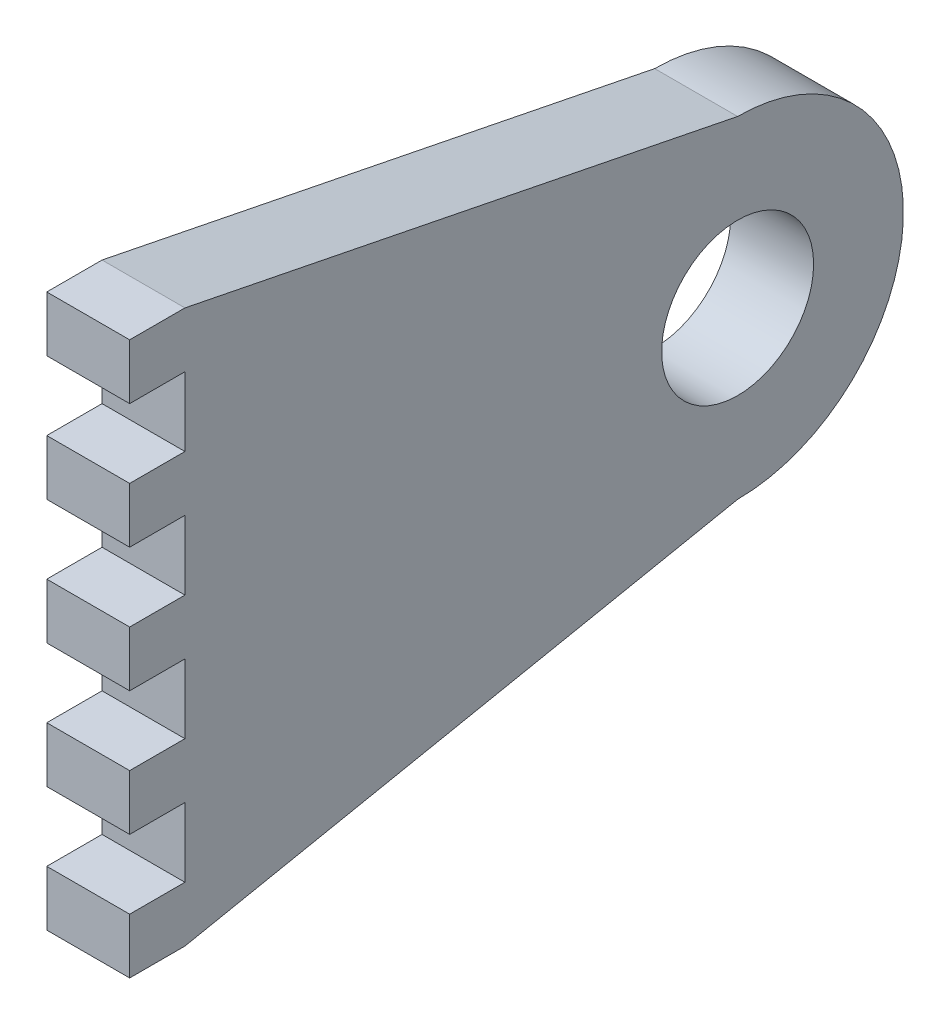
ISO-10303-21;
HEADER;
FILE_DESCRIPTION(('STEP AP214'),'2;1');
FILE_NAME('part.step','',(''),(''),'','','');
FILE_SCHEMA(('AUTOMOTIVE_DESIGN { 1 0 10303 214 1 1 1 1 }'));
ENDSEC;
DATA;
#1=APPLICATION_CONTEXT('core data for automotive mechanical design processes');
#2=APPLICATION_PROTOCOL_DEFINITION('international standard','automotive_design',2000,#1);
#3=PRODUCT_CONTEXT('',#1,'mechanical');
#4=PRODUCT('Part','Part','',(#3));
#5=PRODUCT_RELATED_PRODUCT_CATEGORY('part','',(#4));
#6=PRODUCT_DEFINITION_FORMATION('','',#4);
#7=PRODUCT_DEFINITION_CONTEXT('part definition',#1,'design');
#8=PRODUCT_DEFINITION('design','',#6,#7);
#9=PRODUCT_DEFINITION_SHAPE('','',#8);
#10=(LENGTH_UNIT() NAMED_UNIT(*) SI_UNIT(.MILLI.,.METRE.));
#11=(NAMED_UNIT(*) PLANE_ANGLE_UNIT() SI_UNIT($,.RADIAN.));
#12=(NAMED_UNIT(*) SI_UNIT($,.STERADIAN.) SOLID_ANGLE_UNIT());
#13=UNCERTAINTY_MEASURE_WITH_UNIT(LENGTH_MEASURE(1.E-05),#10,'distance_accuracy_value','');
#14=(GEOMETRIC_REPRESENTATION_CONTEXT(3) GLOBAL_UNCERTAINTY_ASSIGNED_CONTEXT((#13)) GLOBAL_UNIT_ASSIGNED_CONTEXT((#10,
#11,#12)) REPRESENTATION_CONTEXT('',''));
#15=CARTESIAN_POINT('',(0.,0.,0.));
#16=DIRECTION('',(0.,0.,1.));
#17=DIRECTION('',(1.,0.,0.));
#18=AXIS2_PLACEMENT_3D('',#15,#16,#17);
#19=CARTESIAN_POINT('',(3.,0.,0.));
#20=DIRECTION('',(1.,0.,0.));
#21=DIRECTION('',(0.,0.,-1.));
#22=AXIS2_PLACEMENT_3D('',#19,#20,#21);
#23=PLANE('',#22);
#24=DIRECTION('',(0.,-1.,0.));
#25=VECTOR('',#24,1.);
#26=CARTESIAN_POINT('',(3.,8.,19.9999999999999));
#27=LINE('',#26,#25);
#28=CARTESIAN_POINT('',(3.,8.,19.9999999999999));
#29=VERTEX_POINT('',#28);
#30=CARTESIAN_POINT('',(3.,5.5,19.9999999999999));
#31=VERTEX_POINT('',#30);
#32=EDGE_CURVE('E261',#29,#31,#27,.T.);
#33=ORIENTED_EDGE('',*,*,#32,.T.);
#34=DIRECTION('',(0.,0.,1.));
#35=VECTOR('',#34,1.);
#36=CARTESIAN_POINT('',(3.,5.5,19.9999999999999));
#37=LINE('',#36,#35);
#38=CARTESIAN_POINT('',(3.,5.5,21.9999999999999));
#39=VERTEX_POINT('',#38);
#40=EDGE_CURVE('E139',#31,#39,#37,.T.);
#41=ORIENTED_EDGE('',*,*,#40,.T.);
#42=DIRECTION('',(0.,-1.,0.));
#43=VECTOR('',#42,1.);
#44=CARTESIAN_POINT('',(3.,5.5,21.9999999999999));
#45=LINE('',#44,#43);
#46=CARTESIAN_POINT('',(3.,3.5,21.9999999999999));
#47=VERTEX_POINT('',#46);
#48=EDGE_CURVE('E318',#39,#47,#45,.T.);
#49=ORIENTED_EDGE('',*,*,#48,.T.);
#50=DIRECTION('',(0.,0.,-1.));
#51=VECTOR('',#50,1.);
#52=CARTESIAN_POINT('',(3.,3.5,19.9999999999999));
#53=LINE('',#52,#51);
#54=CARTESIAN_POINT('',(3.,3.5,19.9999999999999));
#55=VERTEX_POINT('',#54);
#56=EDGE_CURVE('E337',#47,#55,#53,.T.);
#57=ORIENTED_EDGE('',*,*,#56,.T.);
#58=DIRECTION('',(0.,-1.,0.));
#59=VECTOR('',#58,1.);
#60=CARTESIAN_POINT('',(3.,3.5,19.9999999999999));
#61=LINE('',#60,#59);
#62=CARTESIAN_POINT('',(3.,0.999999999999999,19.9999999999999));
#63=VERTEX_POINT('',#62);
#64=EDGE_CURVE('E334',#55,#63,#61,.T.);
#65=ORIENTED_EDGE('',*,*,#64,.T.);
#66=DIRECTION('',(0.,0.,1.));
#67=VECTOR('',#66,1.);
#68=CARTESIAN_POINT('',(3.,0.999999999999994,21.9999999999999));
#69=LINE('',#68,#67);
#70=CARTESIAN_POINT('',(3.,0.999999999999994,21.9999999999999));
#71=VERTEX_POINT('',#70);
#72=EDGE_CURVE('E336',#63,#71,#69,.T.);
#73=ORIENTED_EDGE('',*,*,#72,.T.);
#74=DIRECTION('',(0.,-1.,0.));
#75=VECTOR('',#74,1.);
#76=CARTESIAN_POINT('',(3.,0.999999999999994,21.9999999999999));
#77=LINE('',#76,#75);
#78=CARTESIAN_POINT('',(3.,-1.,21.9999999999999));
#79=VERTEX_POINT('',#78);
#80=EDGE_CURVE('E339',#71,#79,#77,.T.);
#81=ORIENTED_EDGE('',*,*,#80,.T.);
#82=DIRECTION('',(0.,0.,-1.));
#83=VECTOR('',#82,1.);
#84=CARTESIAN_POINT('',(3.,-1.,19.9999999999999));
#85=LINE('',#84,#83);
#86=CARTESIAN_POINT('',(3.,-1.,19.9999999999999));
#87=VERTEX_POINT('',#86);
#88=EDGE_CURVE('E345',#79,#87,#85,.T.);
#89=ORIENTED_EDGE('',*,*,#88,.T.);
#90=DIRECTION('',(0.,-1.,0.));
#91=VECTOR('',#90,1.);
#92=CARTESIAN_POINT('',(3.,-1.,19.9999999999999));
#93=LINE('',#92,#91);
#94=CARTESIAN_POINT('',(3.,-3.5,19.9999999999999));
#95=VERTEX_POINT('',#94);
#96=EDGE_CURVE('E347',#87,#95,#93,.T.);
#97=ORIENTED_EDGE('',*,*,#96,.T.);
#98=DIRECTION('',(0.,0.,1.));
#99=VECTOR('',#98,1.);
#100=CARTESIAN_POINT('',(3.,-3.5,19.9999999999999));
#101=LINE('',#100,#99);
#102=CARTESIAN_POINT('',(3.,-3.5,21.9999999999999));
#103=VERTEX_POINT('',#102);
#104=EDGE_CURVE('E349',#95,#103,#101,.T.);
#105=ORIENTED_EDGE('',*,*,#104,.T.);
#106=DIRECTION('',(0.,-1.,0.));
#107=VECTOR('',#106,1.);
#108=CARTESIAN_POINT('',(3.,-3.5,21.9999999999999));
#109=LINE('',#108,#107);
#110=CARTESIAN_POINT('',(3.,-5.5,21.9999999999998));
#111=VERTEX_POINT('',#110);
#112=EDGE_CURVE('E351',#103,#111,#109,.T.);
#113=ORIENTED_EDGE('',*,*,#112,.T.);
#114=DIRECTION('',(0.,0.,-1.));
#115=VECTOR('',#114,1.);
#116=CARTESIAN_POINT('',(3.,-5.5,19.9999999999998));
#117=LINE('',#116,#115);
#118=CARTESIAN_POINT('',(3.,-5.5,19.9999999999998));
#119=VERTEX_POINT('',#118);
#120=EDGE_CURVE('E353',#111,#119,#117,.T.);
#121=ORIENTED_EDGE('',*,*,#120,.T.);
#122=DIRECTION('',(0.,-1.,0.));
#123=VECTOR('',#122,1.);
#124=CARTESIAN_POINT('',(3.,-5.5,19.9999999999998));
#125=LINE('',#124,#123);
#126=CARTESIAN_POINT('',(3.,-8.,19.9999999999999));
#127=VERTEX_POINT('',#126);
#128=EDGE_CURVE('E355',#119,#127,#125,.T.);
#129=ORIENTED_EDGE('',*,*,#128,.T.);
#130=DIRECTION('',(0.,0.,1.));
#131=VECTOR('',#130,1.);
#132=CARTESIAN_POINT('',(3.,-8.,19.9999999999999));
#133=LINE('',#132,#131);
#134=CARTESIAN_POINT('',(3.,-8.,21.9999999999999));
#135=VERTEX_POINT('',#134);
#136=EDGE_CURVE('E357',#127,#135,#133,.T.);
#137=ORIENTED_EDGE('',*,*,#136,.T.);
#138=DIRECTION('',(0.,-1.,0.));
#139=VECTOR('',#138,1.);
#140=CARTESIAN_POINT('',(3.,-8.,21.9999999999999));
#141=LINE('',#140,#139);
#142=CARTESIAN_POINT('',(3.,-10.,21.9999999999998));
#143=VERTEX_POINT('',#142);
#144=EDGE_CURVE('E359',#135,#143,#141,.T.);
#145=ORIENTED_EDGE('',*,*,#144,.T.);
#146=DIRECTION('',(0.,0.,-1.));
#147=VECTOR('',#146,1.);
#148=CARTESIAN_POINT('',(3.,-10.,19.9999999999998));
#149=LINE('',#148,#147);
#150=CARTESIAN_POINT('',(3.,-10.,19.9999999999998));
#151=VERTEX_POINT('',#150);
#152=EDGE_CURVE('E361',#143,#151,#149,.T.);
#153=ORIENTED_EDGE('',*,*,#152,.T.);
#154=DIRECTION('',(0.,0.196116135138186,-0.98058067569092));
#155=VECTOR('',#154,1.);
#156=CARTESIAN_POINT('',(3.,-6.,0.));
#157=LINE('',#156,#155);
#158=CARTESIAN_POINT('',(3.,-6.,0.));
#159=VERTEX_POINT('',#158);
#160=EDGE_CURVE('E363',#151,#159,#157,.T.);
#161=ORIENTED_EDGE('',*,*,#160,.T.);
#162=CARTESIAN_POINT('',(3.,0.,0.));
#163=DIRECTION('',(1.,0.,0.));
#164=DIRECTION('',(0.,0.,-1.));
#165=AXIS2_PLACEMENT_3D('',#162,#163,#164);
#166=CIRCLE('',#165,6.);
#167=CARTESIAN_POINT('',(3.,6.,0.));
#168=VERTEX_POINT('',#167);
#169=EDGE_CURVE('E365',#159,#168,#166,.T.);
#170=ORIENTED_EDGE('',*,*,#169,.T.);
#171=DIRECTION('',(0.,0.196116135138185,0.98058067569092));
#172=VECTOR('',#171,1.);
#173=CARTESIAN_POINT('',(3.,6.,0.));
#174=LINE('',#173,#172);
#175=CARTESIAN_POINT('',(3.,9.99999999999999,19.9999999999999));
#176=VERTEX_POINT('',#175);
#177=EDGE_CURVE('E200',#168,#176,#174,.T.);
#178=ORIENTED_EDGE('',*,*,#177,.T.);
#179=DIRECTION('',(0.,0.,1.));
#180=VECTOR('',#179,1.);
#181=CARTESIAN_POINT('',(3.,9.99999999999999,21.9999999999999));
#182=LINE('',#181,#180);
#183=CARTESIAN_POINT('',(3.,9.99999999999999,21.9999999999999));
#184=VERTEX_POINT('',#183);
#185=EDGE_CURVE('E194',#176,#184,#182,.T.);
#186=ORIENTED_EDGE('',*,*,#185,.T.);
#187=DIRECTION('',(0.,-1.,0.));
#188=VECTOR('',#187,1.);
#189=CARTESIAN_POINT('',(3.,9.99999999999999,21.9999999999999));
#190=LINE('',#189,#188);
#191=CARTESIAN_POINT('',(3.,8.,21.9999999999999));
#192=VERTEX_POINT('',#191);
#193=EDGE_CURVE('E198',#184,#192,#190,.T.);
#194=ORIENTED_EDGE('',*,*,#193,.T.);
#195=DIRECTION('',(0.,0.,-1.));
#196=VECTOR('',#195,1.);
#197=CARTESIAN_POINT('',(3.,8.,19.9999999999999));
#198=LINE('',#197,#196);
#199=EDGE_CURVE('E54',#192,#29,#198,.T.);
#200=ORIENTED_EDGE('',*,*,#199,.T.);
#201=EDGE_LOOP('',(#33,#41,#49,#57,#65,#73,#81,#89,#97,#105,#113,#121,#129,#137,#145,#153,#161,
#170,#178,#186,#194,#200));
#202=FACE_BOUND('',#201,.T.);
#203=CARTESIAN_POINT('',(3.,0.,0.));
#204=DIRECTION('',(1.,0.,0.));
#205=DIRECTION('',(0.,0.,-1.));
#206=AXIS2_PLACEMENT_3D('',#203,#204,#205);
#207=CIRCLE('',#206,2.75);
#208=CARTESIAN_POINT('',(3.,0.,-2.75));
#209=VERTEX_POINT('',#208);
#210=EDGE_CURVE('E222',#209,#209,#207,.T.);
#211=ORIENTED_EDGE('',*,*,#210,.F.);
#212=EDGE_LOOP('',(#211));
#213=FACE_BOUND('',#212,.T.);
#214=ADVANCED_FACE('F37',(#202,#213),#23,.T.);
#215=CARTESIAN_POINT('',(0.,0.,0.));
#216=DIRECTION('',(1.,0.,0.));
#217=DIRECTION('',(0.,0.,-1.));
#218=AXIS2_PLACEMENT_3D('',#215,#216,#217);
#219=PLANE('',#218);
#220=DIRECTION('',(0.,-1.,0.));
#221=VECTOR('',#220,1.);
#222=CARTESIAN_POINT('',(0.,8.,19.9999999999999));
#223=LINE('',#222,#221);
#224=CARTESIAN_POINT('',(0.,8.,19.9999999999999));
#225=VERTEX_POINT('',#224);
#226=CARTESIAN_POINT('',(0.,5.5,19.9999999999999));
#227=VERTEX_POINT('',#226);
#228=EDGE_CURVE('E218',#225,#227,#223,.T.);
#229=ORIENTED_EDGE('',*,*,#228,.F.);
#230=DIRECTION('',(0.,0.,-1.));
#231=VECTOR('',#230,1.);
#232=CARTESIAN_POINT('',(0.,8.,19.9999999999999));
#233=LINE('',#232,#231);
#234=CARTESIAN_POINT('',(0.,8.,21.9999999999999));
#235=VERTEX_POINT('',#234);
#236=EDGE_CURVE('E131',#235,#225,#233,.T.);
#237=ORIENTED_EDGE('',*,*,#236,.F.);
#238=DIRECTION('',(0.,-1.,0.));
#239=VECTOR('',#238,1.);
#240=CARTESIAN_POINT('',(0.,9.99999999999999,21.9999999999999));
#241=LINE('',#240,#239);
#242=CARTESIAN_POINT('',(0.,9.99999999999999,21.9999999999999));
#243=VERTEX_POINT('',#242);
#244=EDGE_CURVE('E125',#243,#235,#241,.T.);
#245=ORIENTED_EDGE('',*,*,#244,.F.);
#246=DIRECTION('',(0.,0.,1.));
#247=VECTOR('',#246,1.);
#248=CARTESIAN_POINT('',(0.,9.99999999999999,21.9999999999999));
#249=LINE('',#248,#247);
#250=CARTESIAN_POINT('',(0.,9.99999999999999,19.9999999999999));
#251=VERTEX_POINT('',#250);
#252=EDGE_CURVE('E208',#251,#243,#249,.T.);
#253=ORIENTED_EDGE('',*,*,#252,.F.);
#254=DIRECTION('',(0.,0.196116135138185,0.98058067569092));
#255=VECTOR('',#254,1.);
#256=CARTESIAN_POINT('',(0.,6.,0.));
#257=LINE('',#256,#255);
#258=CARTESIAN_POINT('',(0.,6.,0.));
#259=VERTEX_POINT('',#258);
#260=EDGE_CURVE('E256',#259,#251,#257,.T.);
#261=ORIENTED_EDGE('',*,*,#260,.F.);
#262=CARTESIAN_POINT('',(0.,0.,0.));
#263=DIRECTION('',(1.,0.,0.));
#264=DIRECTION('',(0.,0.,-1.));
#265=AXIS2_PLACEMENT_3D('',#262,#263,#264);
#266=CIRCLE('',#265,6.);
#267=CARTESIAN_POINT('',(0.,-6.,0.));
#268=VERTEX_POINT('',#267);
#269=EDGE_CURVE('E254',#268,#259,#266,.T.);
#270=ORIENTED_EDGE('',*,*,#269,.F.);
#271=DIRECTION('',(0.,0.196116135138186,-0.98058067569092));
#272=VECTOR('',#271,1.);
#273=CARTESIAN_POINT('',(0.,-6.,0.));
#274=LINE('',#273,#272);
#275=CARTESIAN_POINT('',(0.,-10.,19.9999999999998));
#276=VERTEX_POINT('',#275);
#277=EDGE_CURVE('E252',#276,#268,#274,.T.);
#278=ORIENTED_EDGE('',*,*,#277,.F.);
#279=DIRECTION('',(0.,0.,-1.));
#280=VECTOR('',#279,1.);
#281=CARTESIAN_POINT('',(0.,-10.,19.9999999999998));
#282=LINE('',#281,#280);
#283=CARTESIAN_POINT('',(0.,-10.,21.9999999999998));
#284=VERTEX_POINT('',#283);
#285=EDGE_CURVE('E250',#284,#276,#282,.T.);
#286=ORIENTED_EDGE('',*,*,#285,.F.);
#287=DIRECTION('',(0.,-1.,0.));
#288=VECTOR('',#287,1.);
#289=CARTESIAN_POINT('',(0.,-8.,21.9999999999999));
#290=LINE('',#289,#288);
#291=CARTESIAN_POINT('',(0.,-8.,21.9999999999999));
#292=VERTEX_POINT('',#291);
#293=EDGE_CURVE('E248',#292,#284,#290,.T.);
#294=ORIENTED_EDGE('',*,*,#293,.F.);
#295=DIRECTION('',(0.,0.,1.));
#296=VECTOR('',#295,1.);
#297=CARTESIAN_POINT('',(0.,-8.,19.9999999999999));
#298=LINE('',#297,#296);
#299=CARTESIAN_POINT('',(0.,-8.,19.9999999999999));
#300=VERTEX_POINT('',#299);
#301=EDGE_CURVE('E246',#300,#292,#298,.T.);
#302=ORIENTED_EDGE('',*,*,#301,.F.);
#303=DIRECTION('',(0.,-1.,0.));
#304=VECTOR('',#303,1.);
#305=CARTESIAN_POINT('',(0.,-5.5,19.9999999999998));
#306=LINE('',#305,#304);
#307=CARTESIAN_POINT('',(0.,-5.5,19.9999999999998));
#308=VERTEX_POINT('',#307);
#309=EDGE_CURVE('E244',#308,#300,#306,.T.);
#310=ORIENTED_EDGE('',*,*,#309,.F.);
#311=DIRECTION('',(0.,0.,-1.));
#312=VECTOR('',#311,1.);
#313=CARTESIAN_POINT('',(0.,-5.5,19.9999999999998));
#314=LINE('',#313,#312);
#315=CARTESIAN_POINT('',(0.,-5.5,21.9999999999998));
#316=VERTEX_POINT('',#315);
#317=EDGE_CURVE('E242',#316,#308,#314,.T.);
#318=ORIENTED_EDGE('',*,*,#317,.F.);
#319=DIRECTION('',(0.,-1.,0.));
#320=VECTOR('',#319,1.);
#321=CARTESIAN_POINT('',(0.,-3.5,21.9999999999999));
#322=LINE('',#321,#320);
#323=CARTESIAN_POINT('',(0.,-3.5,21.9999999999999));
#324=VERTEX_POINT('',#323);
#325=EDGE_CURVE('E240',#324,#316,#322,.T.);
#326=ORIENTED_EDGE('',*,*,#325,.F.);
#327=DIRECTION('',(0.,0.,1.));
#328=VECTOR('',#327,1.);
#329=CARTESIAN_POINT('',(0.,-3.5,19.9999999999999));
#330=LINE('',#329,#328);
#331=CARTESIAN_POINT('',(0.,-3.5,19.9999999999999));
#332=VERTEX_POINT('',#331);
#333=EDGE_CURVE('E238',#332,#324,#330,.T.);
#334=ORIENTED_EDGE('',*,*,#333,.F.);
#335=DIRECTION('',(0.,-1.,0.));
#336=VECTOR('',#335,1.);
#337=CARTESIAN_POINT('',(0.,-1.,19.9999999999999));
#338=LINE('',#337,#336);
#339=CARTESIAN_POINT('',(0.,-1.,19.9999999999999));
#340=VERTEX_POINT('',#339);
#341=EDGE_CURVE('E236',#340,#332,#338,.T.);
#342=ORIENTED_EDGE('',*,*,#341,.F.);
#343=DIRECTION('',(0.,0.,-1.));
#344=VECTOR('',#343,1.);
#345=CARTESIAN_POINT('',(0.,-1.,19.9999999999999));
#346=LINE('',#345,#344);
#347=CARTESIAN_POINT('',(0.,-1.,21.9999999999999));
#348=VERTEX_POINT('',#347);
#349=EDGE_CURVE('E234',#348,#340,#346,.T.);
#350=ORIENTED_EDGE('',*,*,#349,.F.);
#351=DIRECTION('',(0.,-1.,0.));
#352=VECTOR('',#351,1.);
#353=CARTESIAN_POINT('',(0.,0.999999999999994,21.9999999999999));
#354=LINE('',#353,#352);
#355=CARTESIAN_POINT('',(0.,0.999999999999994,21.9999999999999));
#356=VERTEX_POINT('',#355);
#357=EDGE_CURVE('E232',#356,#348,#354,.T.);
#358=ORIENTED_EDGE('',*,*,#357,.F.);
#359=DIRECTION('',(0.,0.,1.));
#360=VECTOR('',#359,1.);
#361=CARTESIAN_POINT('',(0.,0.999999999999994,21.9999999999999));
#362=LINE('',#361,#360);
#363=CARTESIAN_POINT('',(0.,0.999999999999999,19.9999999999999));
#364=VERTEX_POINT('',#363);
#365=EDGE_CURVE('E230',#364,#356,#362,.T.);
#366=ORIENTED_EDGE('',*,*,#365,.F.);
#367=DIRECTION('',(0.,-1.,0.));
#368=VECTOR('',#367,1.);
#369=CARTESIAN_POINT('',(0.,3.5,19.9999999999999));
#370=LINE('',#369,#368);
#371=CARTESIAN_POINT('',(0.,3.5,19.9999999999999));
#372=VERTEX_POINT('',#371);
#373=EDGE_CURVE('E228',#372,#364,#370,.T.);
#374=ORIENTED_EDGE('',*,*,#373,.F.);
#375=DIRECTION('',(0.,0.,-1.));
#376=VECTOR('',#375,1.);
#377=CARTESIAN_POINT('',(0.,3.5,19.9999999999999));
#378=LINE('',#377,#376);
#379=CARTESIAN_POINT('',(0.,3.5,21.9999999999999));
#380=VERTEX_POINT('',#379);
#381=EDGE_CURVE('E226',#380,#372,#378,.T.);
#382=ORIENTED_EDGE('',*,*,#381,.F.);
#383=DIRECTION('',(0.,-1.,0.));
#384=VECTOR('',#383,1.);
#385=CARTESIAN_POINT('',(0.,5.5,21.9999999999999));
#386=LINE('',#385,#384);
#387=CARTESIAN_POINT('',(0.,5.5,21.9999999999999));
#388=VERTEX_POINT('',#387);
#389=EDGE_CURVE('E224',#388,#380,#386,.T.);
#390=ORIENTED_EDGE('',*,*,#389,.F.);
#391=DIRECTION('',(0.,0.,1.));
#392=VECTOR('',#391,1.);
#393=CARTESIAN_POINT('',(0.,5.5,19.9999999999999));
#394=LINE('',#393,#392);
#395=EDGE_CURVE('E221',#227,#388,#394,.T.);
#396=ORIENTED_EDGE('',*,*,#395,.F.);
#397=EDGE_LOOP('',(#229,#237,#245,#253,#261,#270,#278,#286,#294,#302,#310,#318,#326,#334,#342,
#350,#358,#366,#374,#382,#390,#396));
#398=FACE_BOUND('',#397,.T.);
#399=CARTESIAN_POINT('',(0.,0.,0.));
#400=DIRECTION('',(1.,0.,0.));
#401=DIRECTION('',(0.,0.,-1.));
#402=AXIS2_PLACEMENT_3D('',#399,#400,#401);
#403=CIRCLE('',#402,2.75);
#404=CARTESIAN_POINT('',(0.,0.,-2.75));
#405=VERTEX_POINT('',#404);
#406=EDGE_CURVE('E642',#405,#405,#403,.T.);
#407=ORIENTED_EDGE('',*,*,#406,.T.);
#408=EDGE_LOOP('',(#407));
#409=FACE_BOUND('',#408,.T.);
#410=ADVANCED_FACE('F322',(#398,#409),#219,.F.);
#411=CARTESIAN_POINT('',(3.,8.,19.9999999999999));
#412=DIRECTION('',(0.,0.,-1.));
#413=DIRECTION('',(-1.,0.,0.));
#414=AXIS2_PLACEMENT_3D('',#411,#412,#413);
#415=PLANE('',#414);
#416=ORIENTED_EDGE('',*,*,#228,.T.);
#417=DIRECTION('',(-1.,0.,0.));
#418=VECTOR('',#417,1.);
#419=CARTESIAN_POINT('',(3.,5.5,19.9999999999999));
#420=LINE('',#419,#418);
#421=EDGE_CURVE('E11',#31,#227,#420,.T.);
#422=ORIENTED_EDGE('',*,*,#421,.F.);
#423=ORIENTED_EDGE('',*,*,#32,.F.);
#424=DIRECTION('',(-1.,0.,0.));
#425=VECTOR('',#424,1.);
#426=CARTESIAN_POINT('',(3.,8.,19.9999999999999));
#427=LINE('',#426,#425);
#428=EDGE_CURVE('E214',#29,#225,#427,.T.);
#429=ORIENTED_EDGE('',*,*,#428,.T.);
#430=EDGE_LOOP('',(#416,#422,#423,#429));
#431=FACE_BOUND('',#430,.T.);
#432=ADVANCED_FACE('F39',(#431),#415,.F.);
#433=CARTESIAN_POINT('',(3.,5.5,19.9999999999999));
#434=DIRECTION('',(0.,-1.,0.));
#435=DIRECTION('',(0.,0.,-1.));
#436=AXIS2_PLACEMENT_3D('',#433,#434,#435);
#437=PLANE('',#436);
#438=ORIENTED_EDGE('',*,*,#395,.T.);
#439=DIRECTION('',(-1.,0.,0.));
#440=VECTOR('',#439,1.);
#441=CARTESIAN_POINT('',(3.,5.5,21.9999999999999));
#442=LINE('',#441,#440);
#443=EDGE_CURVE('E46',#39,#388,#442,.T.);
#444=ORIENTED_EDGE('',*,*,#443,.F.);
#445=ORIENTED_EDGE('',*,*,#40,.F.);
#446=ORIENTED_EDGE('',*,*,#421,.T.);
#447=EDGE_LOOP('',(#438,#444,#445,#446));
#448=FACE_BOUND('',#447,.T.);
#449=ADVANCED_FACE('F399',(#448),#437,.F.);
#450=CARTESIAN_POINT('',(3.,5.5,21.9999999999999));
#451=DIRECTION('',(0.,0.,-1.));
#452=DIRECTION('',(-1.,0.,0.));
#453=AXIS2_PLACEMENT_3D('',#450,#451,#452);
#454=PLANE('',#453);
#455=ORIENTED_EDGE('',*,*,#389,.T.);
#456=DIRECTION('',(-1.,0.,0.));
#457=VECTOR('',#456,1.);
#458=CARTESIAN_POINT('',(3.,3.5,21.9999999999999));
#459=LINE('',#458,#457);
#460=EDGE_CURVE('E310',#47,#380,#459,.T.);
#461=ORIENTED_EDGE('',*,*,#460,.F.);
#462=ORIENTED_EDGE('',*,*,#48,.F.);
#463=ORIENTED_EDGE('',*,*,#443,.T.);
#464=EDGE_LOOP('',(#455,#461,#462,#463));
#465=FACE_BOUND('',#464,.T.);
#466=ADVANCED_FACE('F316',(#465),#454,.F.);
#467=CARTESIAN_POINT('',(3.,3.5,19.9999999999999));
#468=DIRECTION('',(0.,1.,0.));
#469=DIRECTION('',(0.,0.,1.));
#470=AXIS2_PLACEMENT_3D('',#467,#468,#469);
#471=PLANE('',#470);
#472=ORIENTED_EDGE('',*,*,#381,.T.);
#473=DIRECTION('',(-1.,0.,0.));
#474=VECTOR('',#473,1.);
#475=CARTESIAN_POINT('',(3.,3.5,19.9999999999999));
#476=LINE('',#475,#474);
#477=EDGE_CURVE('E307',#55,#372,#476,.T.);
#478=ORIENTED_EDGE('',*,*,#477,.F.);
#479=ORIENTED_EDGE('',*,*,#56,.F.);
#480=ORIENTED_EDGE('',*,*,#460,.T.);
#481=EDGE_LOOP('',(#472,#478,#479,#480));
#482=FACE_BOUND('',#481,.T.);
#483=ADVANCED_FACE('F328',(#482),#471,.F.);
#484=CARTESIAN_POINT('',(3.,3.5,19.9999999999999));
#485=DIRECTION('',(0.,0.,-1.));
#486=DIRECTION('',(-1.,0.,0.));
#487=AXIS2_PLACEMENT_3D('',#484,#485,#486);
#488=PLANE('',#487);
#489=ORIENTED_EDGE('',*,*,#373,.T.);
#490=DIRECTION('',(-1.,0.,0.));
#491=VECTOR('',#490,1.);
#492=CARTESIAN_POINT('',(3.,0.999999999999999,19.9999999999999));
#493=LINE('',#492,#491);
#494=EDGE_CURVE('E304',#63,#364,#493,.T.);
#495=ORIENTED_EDGE('',*,*,#494,.F.);
#496=ORIENTED_EDGE('',*,*,#64,.F.);
#497=ORIENTED_EDGE('',*,*,#477,.T.);
#498=EDGE_LOOP('',(#489,#495,#496,#497));
#499=FACE_BOUND('',#498,.T.);
#500=ADVANCED_FACE('F332',(#499),#488,.F.);
#501=CARTESIAN_POINT('',(3.,0.999999999999994,21.9999999999999));
#502=DIRECTION('',(0.,-1.,0.));
#503=DIRECTION('',(0.,0.,-1.));
#504=AXIS2_PLACEMENT_3D('',#501,#502,#503);
#505=PLANE('',#504);
#506=ORIENTED_EDGE('',*,*,#365,.T.);
#507=DIRECTION('',(-1.,0.,0.));
#508=VECTOR('',#507,1.);
#509=CARTESIAN_POINT('',(3.,0.999999999999994,21.9999999999999));
#510=LINE('',#509,#508);
#511=EDGE_CURVE('E301',#71,#356,#510,.T.);
#512=ORIENTED_EDGE('',*,*,#511,.F.);
#513=ORIENTED_EDGE('',*,*,#72,.F.);
#514=ORIENTED_EDGE('',*,*,#494,.T.);
#515=EDGE_LOOP('',(#506,#512,#513,#514));
#516=FACE_BOUND('',#515,.T.);
#517=ADVANCED_FACE('F412',(#516),#505,.F.);
#518=CARTESIAN_POINT('',(3.,0.999999999999994,21.9999999999999));
#519=DIRECTION('',(0.,0.,-1.));
#520=DIRECTION('',(-1.,0.,0.));
#521=AXIS2_PLACEMENT_3D('',#518,#519,#520);
#522=PLANE('',#521);
#523=ORIENTED_EDGE('',*,*,#357,.T.);
#524=DIRECTION('',(-1.,0.,0.));
#525=VECTOR('',#524,1.);
#526=CARTESIAN_POINT('',(3.,-1.,21.9999999999999));
#527=LINE('',#526,#525);
#528=EDGE_CURVE('E298',#79,#348,#527,.T.);
#529=ORIENTED_EDGE('',*,*,#528,.F.);
#530=ORIENTED_EDGE('',*,*,#80,.F.);
#531=ORIENTED_EDGE('',*,*,#511,.T.);
#532=EDGE_LOOP('',(#523,#529,#530,#531));
#533=FACE_BOUND('',#532,.T.);
#534=ADVANCED_FACE('F415',(#533),#522,.F.);
#535=CARTESIAN_POINT('',(3.,-1.,19.9999999999999));
#536=DIRECTION('',(0.,1.,0.));
#537=DIRECTION('',(0.,0.,1.));
#538=AXIS2_PLACEMENT_3D('',#535,#536,#537);
#539=PLANE('',#538);
#540=ORIENTED_EDGE('',*,*,#349,.T.);
#541=DIRECTION('',(-1.,0.,0.));
#542=VECTOR('',#541,1.);
#543=CARTESIAN_POINT('',(3.,-1.,19.9999999999999));
#544=LINE('',#543,#542);
#545=EDGE_CURVE('E295',#87,#340,#544,.T.);
#546=ORIENTED_EDGE('',*,*,#545,.F.);
#547=ORIENTED_EDGE('',*,*,#88,.F.);
#548=ORIENTED_EDGE('',*,*,#528,.T.);
#549=EDGE_LOOP('',(#540,#546,#547,#548));
#550=FACE_BOUND('',#549,.T.);
#551=ADVANCED_FACE('F419',(#550),#539,.F.);
#552=CARTESIAN_POINT('',(3.,-1.,19.9999999999999));
#553=DIRECTION('',(0.,0.,-1.));
#554=DIRECTION('',(0.,1.,0.));
#555=AXIS2_PLACEMENT_3D('',#552,#553,#554);
#556=PLANE('',#555);
#557=ORIENTED_EDGE('',*,*,#341,.T.);
#558=DIRECTION('',(-1.,0.,0.));
#559=VECTOR('',#558,1.);
#560=CARTESIAN_POINT('',(3.,-3.5,19.9999999999999));
#561=LINE('',#560,#559);
#562=EDGE_CURVE('E292',#95,#332,#561,.T.);
#563=ORIENTED_EDGE('',*,*,#562,.F.);
#564=ORIENTED_EDGE('',*,*,#96,.F.);
#565=ORIENTED_EDGE('',*,*,#545,.T.);
#566=EDGE_LOOP('',(#557,#563,#564,#565));
#567=FACE_BOUND('',#566,.T.);
#568=ADVANCED_FACE('F423',(#567),#556,.F.);
#569=CARTESIAN_POINT('',(3.,-3.5,19.9999999999999));
#570=DIRECTION('',(0.,-1.,0.));
#571=DIRECTION('',(0.,0.,-1.));
#572=AXIS2_PLACEMENT_3D('',#569,#570,#571);
#573=PLANE('',#572);
#574=ORIENTED_EDGE('',*,*,#333,.T.);
#575=DIRECTION('',(-1.,0.,0.));
#576=VECTOR('',#575,1.);
#577=CARTESIAN_POINT('',(3.,-3.5,21.9999999999999));
#578=LINE('',#577,#576);
#579=EDGE_CURVE('E289',#103,#324,#578,.T.);
#580=ORIENTED_EDGE('',*,*,#579,.F.);
#581=ORIENTED_EDGE('',*,*,#104,.F.);
#582=ORIENTED_EDGE('',*,*,#562,.T.);
#583=EDGE_LOOP('',(#574,#580,#581,#582));
#584=FACE_BOUND('',#583,.T.);
#585=ADVANCED_FACE('F427',(#584),#573,.F.);
#586=CARTESIAN_POINT('',(3.,-3.5,21.9999999999999));
#587=DIRECTION('',(0.,0.,-1.));
#588=DIRECTION('',(0.,1.,0.));
#589=AXIS2_PLACEMENT_3D('',#586,#587,#588);
#590=PLANE('',#589);
#591=ORIENTED_EDGE('',*,*,#325,.T.);
#592=DIRECTION('',(-1.,0.,0.));
#593=VECTOR('',#592,1.);
#594=CARTESIAN_POINT('',(3.,-5.5,21.9999999999998));
#595=LINE('',#594,#593);
#596=EDGE_CURVE('E286',#111,#316,#595,.T.);
#597=ORIENTED_EDGE('',*,*,#596,.F.);
#598=ORIENTED_EDGE('',*,*,#112,.F.);
#599=ORIENTED_EDGE('',*,*,#579,.T.);
#600=EDGE_LOOP('',(#591,#597,#598,#599));
#601=FACE_BOUND('',#600,.T.);
#602=ADVANCED_FACE('F431',(#601),#590,.F.);
#603=CARTESIAN_POINT('',(3.,-5.5,19.9999999999998));
#604=DIRECTION('',(0.,1.,0.));
#605=DIRECTION('',(0.,0.,1.));
#606=AXIS2_PLACEMENT_3D('',#603,#604,#605);
#607=PLANE('',#606);
#608=ORIENTED_EDGE('',*,*,#317,.T.);
#609=DIRECTION('',(-1.,0.,0.));
#610=VECTOR('',#609,1.);
#611=CARTESIAN_POINT('',(3.,-5.5,19.9999999999998));
#612=LINE('',#611,#610);
#613=EDGE_CURVE('E283',#119,#308,#612,.T.);
#614=ORIENTED_EDGE('',*,*,#613,.F.);
#615=ORIENTED_EDGE('',*,*,#120,.F.);
#616=ORIENTED_EDGE('',*,*,#596,.T.);
#617=EDGE_LOOP('',(#608,#614,#615,#616));
#618=FACE_BOUND('',#617,.T.);
#619=ADVANCED_FACE('F435',(#618),#607,.F.);
#620=CARTESIAN_POINT('',(3.,-5.5,19.9999999999998));
#621=DIRECTION('',(0.,0.,-1.));
#622=DIRECTION('',(0.,1.,0.));
#623=AXIS2_PLACEMENT_3D('',#620,#621,#622);
#624=PLANE('',#623);
#625=ORIENTED_EDGE('',*,*,#309,.T.);
#626=DIRECTION('',(-1.,0.,0.));
#627=VECTOR('',#626,1.);
#628=CARTESIAN_POINT('',(3.,-8.,19.9999999999999));
#629=LINE('',#628,#627);
#630=EDGE_CURVE('E280',#127,#300,#629,.T.);
#631=ORIENTED_EDGE('',*,*,#630,.F.);
#632=ORIENTED_EDGE('',*,*,#128,.F.);
#633=ORIENTED_EDGE('',*,*,#613,.T.);
#634=EDGE_LOOP('',(#625,#631,#632,#633));
#635=FACE_BOUND('',#634,.T.);
#636=ADVANCED_FACE('F439',(#635),#624,.F.);
#637=CARTESIAN_POINT('',(3.,-8.,19.9999999999999));
#638=DIRECTION('',(0.,-1.,0.));
#639=DIRECTION('',(0.,0.,-1.));
#640=AXIS2_PLACEMENT_3D('',#637,#638,#639);
#641=PLANE('',#640);
#642=ORIENTED_EDGE('',*,*,#301,.T.);
#643=DIRECTION('',(-1.,0.,0.));
#644=VECTOR('',#643,1.);
#645=CARTESIAN_POINT('',(3.,-8.,21.9999999999999));
#646=LINE('',#645,#644);
#647=EDGE_CURVE('E277',#135,#292,#646,.T.);
#648=ORIENTED_EDGE('',*,*,#647,.F.);
#649=ORIENTED_EDGE('',*,*,#136,.F.);
#650=ORIENTED_EDGE('',*,*,#630,.T.);
#651=EDGE_LOOP('',(#642,#648,#649,#650));
#652=FACE_BOUND('',#651,.T.);
#653=ADVANCED_FACE('F443',(#652),#641,.F.);
#654=CARTESIAN_POINT('',(3.,-8.,21.9999999999999));
#655=DIRECTION('',(0.,0.,-1.));
#656=DIRECTION('',(0.,1.,0.));
#657=AXIS2_PLACEMENT_3D('',#654,#655,#656);
#658=PLANE('',#657);
#659=ORIENTED_EDGE('',*,*,#293,.T.);
#660=DIRECTION('',(-1.,0.,0.));
#661=VECTOR('',#660,1.);
#662=CARTESIAN_POINT('',(3.,-10.,21.9999999999998));
#663=LINE('',#662,#661);
#664=EDGE_CURVE('E274',#143,#284,#663,.T.);
#665=ORIENTED_EDGE('',*,*,#664,.F.);
#666=ORIENTED_EDGE('',*,*,#144,.F.);
#667=ORIENTED_EDGE('',*,*,#647,.T.);
#668=EDGE_LOOP('',(#659,#665,#666,#667));
#669=FACE_BOUND('',#668,.T.);
#670=ADVANCED_FACE('F447',(#669),#658,.F.);
#671=CARTESIAN_POINT('',(3.,-10.,19.9999999999998));
#672=DIRECTION('',(0.,1.,0.));
#673=DIRECTION('',(0.,0.,1.));
#674=AXIS2_PLACEMENT_3D('',#671,#672,#673);
#675=PLANE('',#674);
#676=ORIENTED_EDGE('',*,*,#285,.T.);
#677=DIRECTION('',(-1.,0.,0.));
#678=VECTOR('',#677,1.);
#679=CARTESIAN_POINT('',(3.,-10.,19.9999999999998));
#680=LINE('',#679,#678);
#681=EDGE_CURVE('E271',#151,#276,#680,.T.);
#682=ORIENTED_EDGE('',*,*,#681,.F.);
#683=ORIENTED_EDGE('',*,*,#152,.F.);
#684=ORIENTED_EDGE('',*,*,#664,.T.);
#685=EDGE_LOOP('',(#676,#682,#683,#684));
#686=FACE_BOUND('',#685,.T.);
#687=ADVANCED_FACE('F451',(#686),#675,.F.);
#688=CARTESIAN_POINT('',(3.,-6.,0.));
#689=DIRECTION('',(0.,0.98058067569092,0.196116135138186));
#690=DIRECTION('',(0.,-0.196116135138186,0.98058067569092));
#691=AXIS2_PLACEMENT_3D('',#688,#689,#690);
#692=PLANE('',#691);
#693=ORIENTED_EDGE('',*,*,#277,.T.);
#694=DIRECTION('',(-1.,0.,0.));
#695=VECTOR('',#694,1.);
#696=CARTESIAN_POINT('',(3.,-6.,0.));
#697=LINE('',#696,#695);
#698=EDGE_CURVE('E268',#159,#268,#697,.T.);
#699=ORIENTED_EDGE('',*,*,#698,.F.);
#700=ORIENTED_EDGE('',*,*,#160,.F.);
#701=ORIENTED_EDGE('',*,*,#681,.T.);
#702=EDGE_LOOP('',(#693,#699,#700,#701));
#703=FACE_BOUND('',#702,.T.);
#704=ADVANCED_FACE('F455',(#703),#692,.F.);
#705=CARTESIAN_POINT('',(3.,0.,0.));
#706=DIRECTION('',(-1.,0.,0.));
#707=DIRECTION('',(0.,0.,1.));
#708=AXIS2_PLACEMENT_3D('',#705,#706,#707);
#709=CYLINDRICAL_SURFACE('',#708,6.);
#710=ORIENTED_EDGE('',*,*,#269,.T.);
#711=DIRECTION('',(-1.,0.,0.));
#712=VECTOR('',#711,1.);
#713=CARTESIAN_POINT('',(3.,6.,0.));
#714=LINE('',#713,#712);
#715=EDGE_CURVE('E265',#168,#259,#714,.T.);
#716=ORIENTED_EDGE('',*,*,#715,.F.);
#717=ORIENTED_EDGE('',*,*,#169,.F.);
#718=ORIENTED_EDGE('',*,*,#698,.T.);
#719=EDGE_LOOP('',(#710,#716,#717,#718));
#720=FACE_BOUND('',#719,.T.);
#721=ADVANCED_FACE('F371',(#720),#709,.T.);
#722=CARTESIAN_POINT('',(3.,6.,0.));
#723=DIRECTION('',(0.,-0.98058067569092,0.196116135138185));
#724=DIRECTION('',(0.,-0.196116135138185,-0.98058067569092));
#725=AXIS2_PLACEMENT_3D('',#722,#723,#724);
#726=PLANE('',#725);
#727=ORIENTED_EDGE('',*,*,#260,.T.);
#728=DIRECTION('',(-1.,0.,0.));
#729=VECTOR('',#728,1.);
#730=CARTESIAN_POINT('',(3.,9.99999999999999,19.9999999999999));
#731=LINE('',#730,#729);
#732=EDGE_CURVE('E209',#176,#251,#731,.T.);
#733=ORIENTED_EDGE('',*,*,#732,.F.);
#734=ORIENTED_EDGE('',*,*,#177,.F.);
#735=ORIENTED_EDGE('',*,*,#715,.T.);
#736=EDGE_LOOP('',(#727,#733,#734,#735));
#737=FACE_BOUND('',#736,.T.);
#738=ADVANCED_FACE('F375',(#737),#726,.F.);
#739=CARTESIAN_POINT('',(3.,9.99999999999999,21.9999999999999));
#740=DIRECTION('',(0.,-1.,0.));
#741=DIRECTION('',(0.,0.,-1.));
#742=AXIS2_PLACEMENT_3D('',#739,#740,#741);
#743=PLANE('',#742);
#744=ORIENTED_EDGE('',*,*,#252,.T.);
#745=DIRECTION('',(-1.,0.,0.));
#746=VECTOR('',#745,1.);
#747=CARTESIAN_POINT('',(3.,9.99999999999999,21.9999999999999));
#748=LINE('',#747,#746);
#749=EDGE_CURVE('E205',#184,#243,#748,.T.);
#750=ORIENTED_EDGE('',*,*,#749,.F.);
#751=ORIENTED_EDGE('',*,*,#185,.F.);
#752=ORIENTED_EDGE('',*,*,#732,.T.);
#753=EDGE_LOOP('',(#744,#750,#751,#752));
#754=FACE_BOUND('',#753,.T.);
#755=ADVANCED_FACE('F206',(#754),#743,.F.);
#756=CARTESIAN_POINT('',(3.,9.99999999999999,21.9999999999999));
#757=DIRECTION('',(0.,0.,-1.));
#758=DIRECTION('',(-1.,0.,0.));
#759=AXIS2_PLACEMENT_3D('',#756,#757,#758);
#760=PLANE('',#759);
#761=ORIENTED_EDGE('',*,*,#244,.T.);
#762=DIRECTION('',(-1.,0.,0.));
#763=VECTOR('',#762,1.);
#764=CARTESIAN_POINT('',(3.,8.,21.9999999999999));
#765=LINE('',#764,#763);
#766=EDGE_CURVE('E210',#192,#235,#765,.T.);
#767=ORIENTED_EDGE('',*,*,#766,.F.);
#768=ORIENTED_EDGE('',*,*,#193,.F.);
#769=ORIENTED_EDGE('',*,*,#749,.T.);
#770=EDGE_LOOP('',(#761,#767,#768,#769));
#771=FACE_BOUND('',#770,.T.);
#772=ADVANCED_FACE('F212',(#771),#760,.F.);
#773=CARTESIAN_POINT('',(3.,8.,19.9999999999999));
#774=DIRECTION('',(0.,1.,0.));
#775=DIRECTION('',(0.,0.,1.));
#776=AXIS2_PLACEMENT_3D('',#773,#774,#775);
#777=PLANE('',#776);
#778=ORIENTED_EDGE('',*,*,#236,.T.);
#779=ORIENTED_EDGE('',*,*,#428,.F.);
#780=ORIENTED_EDGE('',*,*,#199,.F.);
#781=ORIENTED_EDGE('',*,*,#766,.T.);
#782=EDGE_LOOP('',(#778,#779,#780,#781));
#783=FACE_BOUND('',#782,.T.);
#784=ADVANCED_FACE('F379',(#783),#777,.F.);
#785=CARTESIAN_POINT('',(3.,0.,0.));
#786=DIRECTION('',(-1.,0.,0.));
#787=DIRECTION('',(0.,0.,1.));
#788=AXIS2_PLACEMENT_3D('',#785,#786,#787);
#789=CYLINDRICAL_SURFACE('',#788,2.75);
#790=ORIENTED_EDGE('',*,*,#210,.T.);
#791=EDGE_LOOP('',(#790));
#792=FACE_BOUND('',#791,.T.);
#793=ORIENTED_EDGE('',*,*,#406,.F.);
#794=EDGE_LOOP('',(#793));
#795=FACE_BOUND('',#794,.T.);
#796=ADVANCED_FACE('F381',(#792,#795),#789,.F.);
#797=CLOSED_SHELL('',(#214,#410,#432,#449,#466,#483,#500,#517,#534,#551,#568,#585,#602,#619,
#636,#653,#670,#687,#704,#721,#738,#755,#772,#784,#796));
#798=MANIFOLD_SOLID_BREP('B2',#797);
#799=ADVANCED_BREP_SHAPE_REPRESENTATION('',(#18,#798),#14);
#800=SHAPE_DEFINITION_REPRESENTATION(#9,#799);
ENDSEC;
END-ISO-10303-21;
